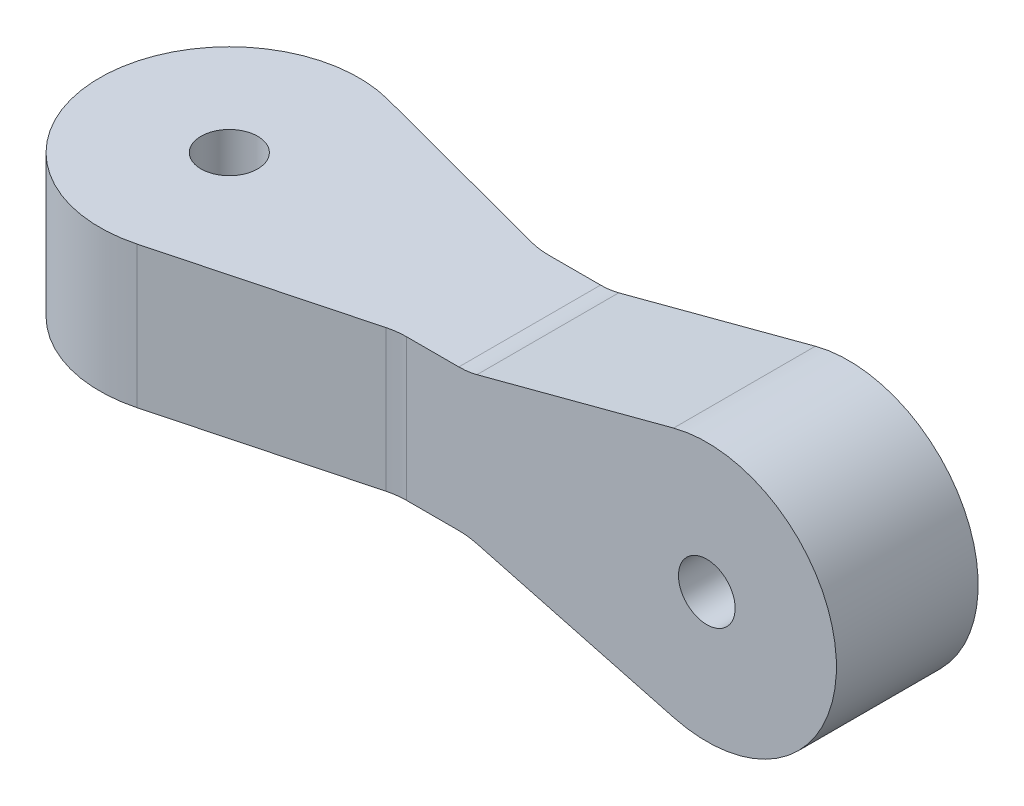
ISO-10303-21;
HEADER;
FILE_DESCRIPTION(('STEP AP214'),'2;1');
FILE_NAME('part.step','',(''),(''),'','','');
FILE_SCHEMA(('AUTOMOTIVE_DESIGN { 1 0 10303 214 1 1 1 1 }'));
ENDSEC;
DATA;
#1=APPLICATION_CONTEXT('core data for automotive mechanical design processes');
#2=APPLICATION_PROTOCOL_DEFINITION('international standard','automotive_design',2000,#1);
#3=PRODUCT_CONTEXT('',#1,'mechanical');
#4=PRODUCT('Part','Part','',(#3));
#5=PRODUCT_RELATED_PRODUCT_CATEGORY('part','',(#4));
#6=PRODUCT_DEFINITION_FORMATION('','',#4);
#7=PRODUCT_DEFINITION_CONTEXT('part definition',#1,'design');
#8=PRODUCT_DEFINITION('design','',#6,#7);
#9=PRODUCT_DEFINITION_SHAPE('','',#8);
#10=(LENGTH_UNIT() NAMED_UNIT(*) SI_UNIT(.MILLI.,.METRE.));
#11=(NAMED_UNIT(*) PLANE_ANGLE_UNIT() SI_UNIT($,.RADIAN.));
#12=(NAMED_UNIT(*) SI_UNIT($,.STERADIAN.) SOLID_ANGLE_UNIT());
#13=UNCERTAINTY_MEASURE_WITH_UNIT(LENGTH_MEASURE(1.E-05),#10,'distance_accuracy_value','');
#14=(GEOMETRIC_REPRESENTATION_CONTEXT(3) GLOBAL_UNCERTAINTY_ASSIGNED_CONTEXT((#13)) GLOBAL_UNIT_ASSIGNED_CONTEXT((#10,
#11,#12)) REPRESENTATION_CONTEXT('',''));
#15=CARTESIAN_POINT('',(0.,0.,0.));
#16=DIRECTION('',(0.,0.,1.));
#17=DIRECTION('',(1.,0.,0.));
#18=AXIS2_PLACEMENT_3D('',#15,#16,#17);
#19=CARTESIAN_POINT('',(0.,0.,-10.));
#20=DIRECTION('',(0.,0.,1.));
#21=DIRECTION('',(1.,0.,0.));
#22=AXIS2_PLACEMENT_3D('',#19,#20,#21);
#23=CYLINDRICAL_SURFACE('',#22,18.2908404288296);
#24=CARTESIAN_POINT('',(0.,0.,10.));
#25=DIRECTION('',(0.,0.,1.));
#26=DIRECTION('',(-1.,0.,0.));
#27=AXIS2_PLACEMENT_3D('',#24,#25,#26);
#28=CIRCLE('',#27,18.2908404288296);
#29=CARTESIAN_POINT('',(-4.6831537061616,-17.6811457478686,10.));
#30=VERTEX_POINT('',#29);
#31=CARTESIAN_POINT('',(-4.6831537061616,17.6811457478686,10.));
#32=VERTEX_POINT('',#31);
#33=EDGE_CURVE('E176',#30,#32,#28,.T.);
#34=ORIENTED_EDGE('',*,*,#33,.F.);
#35=DIRECTION('',(0.,0.,1.));
#36=VECTOR('',#35,1.);
#37=CARTESIAN_POINT('',(-4.6831537061616,-17.6811457478686,-10.));
#38=LINE('',#37,#36);
#39=CARTESIAN_POINT('',(-4.6831537061616,-17.6811457478686,-10.));
#40=VERTEX_POINT('',#39);
#41=EDGE_CURVE('E194',#40,#30,#38,.T.);
#42=ORIENTED_EDGE('',*,*,#41,.F.);
#43=CARTESIAN_POINT('',(0.,0.,-10.));
#44=DIRECTION('',(0.,0.,1.));
#45=DIRECTION('',(-1.,0.,0.));
#46=AXIS2_PLACEMENT_3D('',#43,#44,#45);
#47=CIRCLE('',#46,18.2908404288296);
#48=CARTESIAN_POINT('',(-4.6831537061616,17.6811457478686,-10.));
#49=VERTEX_POINT('',#48);
#50=EDGE_CURVE('E179',#40,#49,#47,.T.);
#51=ORIENTED_EDGE('',*,*,#50,.T.);
#52=DIRECTION('',(0.,0.,1.));
#53=VECTOR('',#52,1.);
#54=CARTESIAN_POINT('',(-4.6831537061616,17.6811457478686,-10.));
#55=LINE('',#54,#53);
#56=EDGE_CURVE('E188',#49,#32,#55,.T.);
#57=ORIENTED_EDGE('',*,*,#56,.T.);
#58=EDGE_LOOP('',(#34,#42,#51,#57));
#59=FACE_BOUND('',#58,.T.);
#60=ADVANCED_FACE('F34',(#59),#23,.T.);
#61=CARTESIAN_POINT('',(-4.6831537061616,-17.6811457478686,-10.));
#62=DIRECTION('',(-0.256038191595621,-0.966666666666667,0.));
#63=DIRECTION('',(0.966666666666667,-0.256038191595621,0.));
#64=AXIS2_PLACEMENT_3D('',#61,#62,#63);
#65=PLANE('',#64);
#66=DIRECTION('',(0.966666666666667,-0.256038191595621,0.));
#67=VECTOR('',#66,1.);
#68=CARTESIAN_POINT('',(-4.6831537061616,-17.6811457478686,10.));
#69=LINE('',#68,#67);
#70=CARTESIAN_POINT('',(-32.4246609000136,-10.3333333333333,10.));
#71=VERTEX_POINT('',#70);
#72=EDGE_CURVE('E183',#71,#30,#69,.T.);
#73=ORIENTED_EDGE('',*,*,#72,.F.);
#74=DIRECTION('',(0.,0.,1.));
#75=VECTOR('',#74,1.);
#76=CARTESIAN_POINT('',(-32.4246609000136,-10.3333333333333,-10.));
#77=LINE('',#76,#75);
#78=CARTESIAN_POINT('',(-32.4246609000136,-10.3333333333333,-10.));
#79=VERTEX_POINT('',#78);
#80=EDGE_CURVE('E201',#71,#79,#77,.F.);
#81=ORIENTED_EDGE('',*,*,#80,.T.);
#82=DIRECTION('',(0.966666666666667,-0.256038191595621,0.));
#83=VECTOR('',#82,1.);
#84=CARTESIAN_POINT('',(-4.6831537061616,-17.6811457478686,-10.));
#85=LINE('',#84,#83);
#86=EDGE_CURVE('E186',#79,#40,#85,.T.);
#87=ORIENTED_EDGE('',*,*,#86,.T.);
#88=ORIENTED_EDGE('',*,*,#41,.T.);
#89=EDGE_LOOP('',(#73,#81,#87,#88));
#90=FACE_BOUND('',#89,.T.);
#91=ADVANCED_FACE('F264',(#90),#65,.T.);
#92=CARTESIAN_POINT('',(-4.6831537061616,17.6811457478686,-10.));
#93=DIRECTION('',(-0.256038191595621,0.966666666666667,0.));
#94=DIRECTION('',(-0.966666666666667,-0.256038191595621,0.));
#95=AXIS2_PLACEMENT_3D('',#92,#93,#94);
#96=PLANE('',#95);
#97=DIRECTION('',(-0.966666666666667,-0.256038191595621,0.));
#98=VECTOR('',#97,1.);
#99=CARTESIAN_POINT('',(-4.6831537061616,17.6811457478686,-10.));
#100=LINE('',#99,#98);
#101=CARTESIAN_POINT('',(-32.4246609000136,10.3333333333333,-10.));
#102=VERTEX_POINT('',#101);
#103=EDGE_CURVE('E182',#49,#102,#100,.T.);
#104=ORIENTED_EDGE('',*,*,#103,.T.);
#105=DIRECTION('',(0.,0.,1.));
#106=VECTOR('',#105,1.);
#107=CARTESIAN_POINT('',(-32.4246609000136,10.3333333333333,-10.));
#108=LINE('',#107,#106);
#109=CARTESIAN_POINT('',(-32.4246609000136,10.3333333333333,10.));
#110=VERTEX_POINT('',#109);
#111=EDGE_CURVE('E203',#102,#110,#108,.T.);
#112=ORIENTED_EDGE('',*,*,#111,.T.);
#113=DIRECTION('',(-0.966666666666667,-0.256038191595621,0.));
#114=VECTOR('',#113,1.);
#115=CARTESIAN_POINT('',(-4.6831537061616,17.6811457478686,10.));
#116=LINE('',#115,#114);
#117=EDGE_CURVE('E191',#32,#110,#116,.T.);
#118=ORIENTED_EDGE('',*,*,#117,.F.);
#119=ORIENTED_EDGE('',*,*,#56,.F.);
#120=EDGE_LOOP('',(#104,#112,#118,#119));
#121=FACE_BOUND('',#120,.T.);
#122=ADVANCED_FACE('F270',(#121),#96,.T.);
#123=CARTESIAN_POINT('',(0.,0.,-10.));
#124=DIRECTION('',(0.,0.,-1.));
#125=DIRECTION('',(-1.,0.,0.));
#126=AXIS2_PLACEMENT_3D('',#123,#124,#125);
#127=PLANE('',#126);
#128=CARTESIAN_POINT('',(0.,0.,-10.));
#129=DIRECTION('',(0.,0.,1.));
#130=DIRECTION('',(1.,0.,0.));
#131=AXIS2_PLACEMENT_3D('',#128,#129,#130);
#132=CIRCLE('',#131,4.);
#133=CARTESIAN_POINT('',(4.,0.,-10.));
#134=VERTEX_POINT('',#133);
#135=EDGE_CURVE('E173',#134,#134,#132,.T.);
#136=ORIENTED_EDGE('',*,*,#135,.T.);
#137=EDGE_LOOP('',(#136));
#138=FACE_BOUND('',#137,.T.);
#139=DIRECTION('',(1.,0.,0.));
#140=VECTOR('',#139,1.);
#141=CARTESIAN_POINT('',(-43.6831537061616,-10.,-10.));
#142=LINE('',#141,#140);
#143=CARTESIAN_POINT('',(-42.3812645963534,-10.,-10.));
#144=VERTEX_POINT('',#143);
#145=CARTESIAN_POINT('',(-34.9850428159698,-10.,-10.));
#146=VERTEX_POINT('',#145);
#147=EDGE_CURVE('E161',#144,#146,#142,.T.);
#148=ORIENTED_EDGE('',*,*,#147,.F.);
#149=DIRECTION('',(0.,-1.,0.));
#150=VECTOR('',#149,1.);
#151=CARTESIAN_POINT('',(-42.3812645963534,10.,-10.));
#152=LINE('',#151,#150);
#153=CARTESIAN_POINT('',(-42.3812645963534,10.,-10.));
#154=VERTEX_POINT('',#153);
#155=EDGE_CURVE('E209',#144,#154,#152,.F.);
#156=ORIENTED_EDGE('',*,*,#155,.T.);
#157=DIRECTION('',(1.,0.,0.));
#158=VECTOR('',#157,1.);
#159=CARTESIAN_POINT('',(-43.6831537061616,10.,-10.));
#160=LINE('',#159,#158);
#161=CARTESIAN_POINT('',(-34.9850428159698,10.,-10.));
#162=VERTEX_POINT('',#161);
#163=EDGE_CURVE('E164',#154,#162,#160,.T.);
#164=ORIENTED_EDGE('',*,*,#163,.T.);
#165=CARTESIAN_POINT('',(-34.9850428159698,20.,-10.));
#166=DIRECTION('',(0.,0.,-1.));
#167=DIRECTION('',(-1.,0.,0.));
#168=AXIS2_PLACEMENT_3D('',#165,#166,#167);
#169=CIRCLE('',#168,10.);
#170=EDGE_CURVE('E221',#162,#102,#169,.F.);
#171=ORIENTED_EDGE('',*,*,#170,.T.);
#172=ORIENTED_EDGE('',*,*,#103,.F.);
#173=ORIENTED_EDGE('',*,*,#50,.F.);
#174=ORIENTED_EDGE('',*,*,#86,.F.);
#175=CARTESIAN_POINT('',(-34.9850428159698,-20.,-10.));
#176=DIRECTION('',(0.,0.,-1.));
#177=DIRECTION('',(-1.,0.,0.));
#178=AXIS2_PLACEMENT_3D('',#175,#176,#177);
#179=CIRCLE('',#178,10.);
#180=EDGE_CURVE('E218',#79,#146,#179,.F.);
#181=ORIENTED_EDGE('',*,*,#180,.T.);
#182=EDGE_LOOP('',(#148,#156,#164,#171,#172,#173,#174,#181));
#183=FACE_BOUND('',#182,.T.);
#184=ADVANCED_FACE('F236',(#138,#183),#127,.T.);
#185=CARTESIAN_POINT('',(0.,0.,10.));
#186=DIRECTION('',(0.,0.,-1.));
#187=DIRECTION('',(-1.,0.,0.));
#188=AXIS2_PLACEMENT_3D('',#185,#186,#187);
#189=PLANE('',#188);
#190=CARTESIAN_POINT('',(0.,0.,10.));
#191=DIRECTION('',(0.,0.,1.));
#192=DIRECTION('',(1.,0.,0.));
#193=AXIS2_PLACEMENT_3D('',#190,#191,#192);
#194=CIRCLE('',#193,4.);
#195=CARTESIAN_POINT('',(4.,0.,10.));
#196=VERTEX_POINT('',#195);
#197=EDGE_CURVE('E172',#196,#196,#194,.T.);
#198=ORIENTED_EDGE('',*,*,#197,.F.);
#199=EDGE_LOOP('',(#198));
#200=FACE_BOUND('',#199,.T.);
#201=DIRECTION('',(1.,0.,0.));
#202=VECTOR('',#201,1.);
#203=CARTESIAN_POINT('',(-43.6831537061616,10.,10.));
#204=LINE('',#203,#202);
#205=CARTESIAN_POINT('',(-42.3812645963534,10.,10.));
#206=VERTEX_POINT('',#205);
#207=CARTESIAN_POINT('',(-34.9850428159698,10.,10.));
#208=VERTEX_POINT('',#207);
#209=EDGE_CURVE('E167',#206,#208,#204,.T.);
#210=ORIENTED_EDGE('',*,*,#209,.F.);
#211=DIRECTION('',(0.,1.,0.));
#212=VECTOR('',#211,1.);
#213=CARTESIAN_POINT('',(-42.3812645963534,-10.,10.));
#214=LINE('',#213,#212);
#215=CARTESIAN_POINT('',(-42.3812645963534,-10.,10.));
#216=VERTEX_POINT('',#215);
#217=EDGE_CURVE('E214',#206,#216,#214,.F.);
#218=ORIENTED_EDGE('',*,*,#217,.T.);
#219=DIRECTION('',(1.,0.,0.));
#220=VECTOR('',#219,1.);
#221=CARTESIAN_POINT('',(-43.6831537061616,-10.,10.));
#222=LINE('',#221,#220);
#223=CARTESIAN_POINT('',(-34.9850428159698,-10.,10.));
#224=VERTEX_POINT('',#223);
#225=EDGE_CURVE('E169',#216,#224,#222,.T.);
#226=ORIENTED_EDGE('',*,*,#225,.T.);
#227=CARTESIAN_POINT('',(-34.9850428159698,-20.,10.));
#228=DIRECTION('',(0.,0.,-1.));
#229=DIRECTION('',(-1.,0.,0.));
#230=AXIS2_PLACEMENT_3D('',#227,#228,#229);
#231=CIRCLE('',#230,10.);
#232=EDGE_CURVE('E216',#224,#71,#231,.T.);
#233=ORIENTED_EDGE('',*,*,#232,.T.);
#234=ORIENTED_EDGE('',*,*,#72,.T.);
#235=ORIENTED_EDGE('',*,*,#33,.T.);
#236=ORIENTED_EDGE('',*,*,#117,.T.);
#237=CARTESIAN_POINT('',(-34.9850428159698,20.,10.));
#238=DIRECTION('',(0.,0.,-1.));
#239=DIRECTION('',(-1.,0.,0.));
#240=AXIS2_PLACEMENT_3D('',#237,#238,#239);
#241=CIRCLE('',#240,10.);
#242=EDGE_CURVE('E49',#110,#208,#241,.T.);
#243=ORIENTED_EDGE('',*,*,#242,.T.);
#244=EDGE_LOOP('',(#210,#218,#226,#233,#234,#235,#236,#243));
#245=FACE_BOUND('',#244,.T.);
#246=ADVANCED_FACE('F245',(#200,#245),#189,.F.);
#247=CARTESIAN_POINT('',(0.,0.,-10.));
#248=DIRECTION('',(0.,0.,1.));
#249=DIRECTION('',(1.,0.,0.));
#250=AXIS2_PLACEMENT_3D('',#247,#248,#249);
#251=CYLINDRICAL_SURFACE('',#250,4.);
#252=ORIENTED_EDGE('',*,*,#135,.F.);
#253=EDGE_LOOP('',(#252));
#254=FACE_BOUND('',#253,.T.);
#255=ORIENTED_EDGE('',*,*,#197,.T.);
#256=EDGE_LOOP('',(#255));
#257=FACE_BOUND('',#256,.T.);
#258=ADVANCED_FACE('F334',(#254,#257),#251,.F.);
#259=CARTESIAN_POINT('',(-43.6831537061616,-10.,-10.));
#260=DIRECTION('',(0.,1.,0.));
#261=DIRECTION('',(0.,0.,1.));
#262=AXIS2_PLACEMENT_3D('',#259,#260,#261);
#263=PLANE('',#262);
#264=ORIENTED_EDGE('',*,*,#147,.T.);
#265=DIRECTION('',(0.,0.,1.));
#266=VECTOR('',#265,1.);
#267=CARTESIAN_POINT('',(-34.9850428159698,-10.,-10.));
#268=LINE('',#267,#266);
#269=EDGE_CURVE('E197',#146,#224,#268,.T.);
#270=ORIENTED_EDGE('',*,*,#269,.T.);
#271=ORIENTED_EDGE('',*,*,#225,.F.);
#272=CARTESIAN_POINT('',(-42.3812645963534,-10.,20.));
#273=DIRECTION('',(0.,1.,0.));
#274=DIRECTION('',(0.,0.,1.));
#275=AXIS2_PLACEMENT_3D('',#272,#273,#274);
#276=CIRCLE('',#275,10.);
#277=CARTESIAN_POINT('',(-44.9416465123096,-10.,10.3333333333333));
#278=VERTEX_POINT('',#277);
#279=EDGE_CURVE('E11',#216,#278,#276,.T.);
#280=ORIENTED_EDGE('',*,*,#279,.T.);
#281=DIRECTION('',(-0.966666666666667,0.,0.25603819159562));
#282=VECTOR('',#281,1.);
#283=CARTESIAN_POINT('',(-0.388637557535156,-10.,-1.46729271107073));
#284=LINE('',#283,#282);
#285=CARTESIAN_POINT('',(-72.6831537061616,-10.,17.6811457478686));
#286=VERTEX_POINT('',#285);
#287=EDGE_CURVE('E142',#278,#286,#284,.T.);
#288=ORIENTED_EDGE('',*,*,#287,.T.);
#289=CARTESIAN_POINT('',(-77.3663074123232,-10.,0.));
#290=DIRECTION('',(0.,1.,0.));
#291=DIRECTION('',(0.,0.,1.));
#292=AXIS2_PLACEMENT_3D('',#289,#290,#291);
#293=CIRCLE('',#292,18.2908404288296);
#294=CARTESIAN_POINT('',(-72.6831537061616,-10.,-17.6811457478686));
#295=VERTEX_POINT('',#294);
#296=EDGE_CURVE('E132',#295,#286,#293,.T.);
#297=ORIENTED_EDGE('',*,*,#296,.F.);
#298=DIRECTION('',(-0.966666666666667,0.,-0.25603819159562));
#299=VECTOR('',#298,1.);
#300=CARTESIAN_POINT('',(-0.388637557535156,-10.,1.46729271107073));
#301=LINE('',#300,#299);
#302=CARTESIAN_POINT('',(-44.9416465123096,-10.,-10.3333333333333));
#303=VERTEX_POINT('',#302);
#304=EDGE_CURVE('E122',#303,#295,#301,.T.);
#305=ORIENTED_EDGE('',*,*,#304,.F.);
#306=CARTESIAN_POINT('',(-42.3812645963534,-10.,-20.));
#307=DIRECTION('',(0.,1.,0.));
#308=DIRECTION('',(0.,0.,1.));
#309=AXIS2_PLACEMENT_3D('',#306,#307,#308);
#310=CIRCLE('',#309,10.);
#311=EDGE_CURVE('E223',#303,#144,#310,.T.);
#312=ORIENTED_EDGE('',*,*,#311,.T.);
#313=EDGE_LOOP('',(#264,#270,#271,#280,#288,#297,#305,#312));
#314=FACE_BOUND('',#313,.T.);
#315=CARTESIAN_POINT('',(-77.3663074123232,-10.,0.));
#316=DIRECTION('',(0.,1.,0.));
#317=DIRECTION('',(0.,0.,1.));
#318=AXIS2_PLACEMENT_3D('',#315,#316,#317);
#319=CIRCLE('',#318,4.00000000000001);
#320=CARTESIAN_POINT('',(-77.3663074123232,-10.,4.00000000000002));
#321=VERTEX_POINT('',#320);
#322=EDGE_CURVE('E133',#321,#321,#319,.T.);
#323=ORIENTED_EDGE('',*,*,#322,.T.);
#324=EDGE_LOOP('',(#323));
#325=FACE_BOUND('',#324,.T.);
#326=ADVANCED_FACE('F145',(#314,#325),#263,.F.);
#327=CARTESIAN_POINT('',(-43.6831537061616,10.,10.));
#328=DIRECTION('',(0.,-1.,0.));
#329=DIRECTION('',(0.,0.,-1.));
#330=AXIS2_PLACEMENT_3D('',#327,#328,#329);
#331=PLANE('',#330);
#332=ORIENTED_EDGE('',*,*,#209,.T.);
#333=DIRECTION('',(0.,0.,1.));
#334=VECTOR('',#333,1.);
#335=CARTESIAN_POINT('',(-34.9850428159698,10.,10.));
#336=LINE('',#335,#334);
#337=EDGE_CURVE('E206',#208,#162,#336,.F.);
#338=ORIENTED_EDGE('',*,*,#337,.T.);
#339=ORIENTED_EDGE('',*,*,#163,.F.);
#340=CARTESIAN_POINT('',(-42.3812645963534,10.,-20.));
#341=DIRECTION('',(0.,-1.,0.));
#342=DIRECTION('',(0.,0.,-1.));
#343=AXIS2_PLACEMENT_3D('',#340,#341,#342);
#344=CIRCLE('',#343,10.);
#345=CARTESIAN_POINT('',(-44.9416465123096,10.,-10.3333333333333));
#346=VERTEX_POINT('',#345);
#347=EDGE_CURVE('E225',#154,#346,#344,.T.);
#348=ORIENTED_EDGE('',*,*,#347,.T.);
#349=DIRECTION('',(-0.966666666666667,0.,-0.25603819159562));
#350=VECTOR('',#349,1.);
#351=CARTESIAN_POINT('',(-0.388637557535156,10.,1.46729271107073));
#352=LINE('',#351,#350);
#353=CARTESIAN_POINT('',(-72.6831537061616,10.,-17.6811457478686));
#354=VERTEX_POINT('',#353);
#355=EDGE_CURVE('E156',#346,#354,#352,.T.);
#356=ORIENTED_EDGE('',*,*,#355,.T.);
#357=CARTESIAN_POINT('',(-77.3663074123232,10.,0.));
#358=DIRECTION('',(0.,1.,0.));
#359=DIRECTION('',(0.,0.,1.));
#360=AXIS2_PLACEMENT_3D('',#357,#358,#359);
#361=CIRCLE('',#360,18.2908404288296);
#362=CARTESIAN_POINT('',(-72.6831537061616,10.,17.6811457478686));
#363=VERTEX_POINT('',#362);
#364=EDGE_CURVE('E140',#354,#363,#361,.T.);
#365=ORIENTED_EDGE('',*,*,#364,.T.);
#366=DIRECTION('',(-0.966666666666667,0.,0.25603819159562));
#367=VECTOR('',#366,1.);
#368=CARTESIAN_POINT('',(-0.388637557535156,10.,-1.46729271107073));
#369=LINE('',#368,#367);
#370=CARTESIAN_POINT('',(-44.9416465123096,10.,10.3333333333333));
#371=VERTEX_POINT('',#370);
#372=EDGE_CURVE('E159',#371,#363,#369,.T.);
#373=ORIENTED_EDGE('',*,*,#372,.F.);
#374=CARTESIAN_POINT('',(-42.3812645963534,10.,20.));
#375=DIRECTION('',(0.,-1.,0.));
#376=DIRECTION('',(0.,0.,-1.));
#377=AXIS2_PLACEMENT_3D('',#374,#375,#376);
#378=CIRCLE('',#377,10.);
#379=EDGE_CURVE('E42',#371,#206,#378,.T.);
#380=ORIENTED_EDGE('',*,*,#379,.T.);
#381=EDGE_LOOP('',(#332,#338,#339,#348,#356,#365,#373,#380));
#382=FACE_BOUND('',#381,.T.);
#383=CARTESIAN_POINT('',(-77.3663074123232,10.,0.));
#384=DIRECTION('',(0.,1.,0.));
#385=DIRECTION('',(0.,0.,1.));
#386=AXIS2_PLACEMENT_3D('',#383,#384,#385);
#387=CIRCLE('',#386,4.00000000000001);
#388=CARTESIAN_POINT('',(-77.3663074123232,10.,4.00000000000002));
#389=VERTEX_POINT('',#388);
#390=EDGE_CURVE('E153',#389,#389,#387,.T.);
#391=ORIENTED_EDGE('',*,*,#390,.F.);
#392=EDGE_LOOP('',(#391));
#393=FACE_BOUND('',#392,.T.);
#394=ADVANCED_FACE('F228',(#382,#393),#331,.F.);
#395=CARTESIAN_POINT('',(-0.388637557535156,-10.,1.46729271107073));
#396=DIRECTION('',(0.25603819159562,0.,-0.966666666666667));
#397=DIRECTION('',(-0.966666666666667,0.,-0.25603819159562));
#398=AXIS2_PLACEMENT_3D('',#395,#396,#397);
#399=PLANE('',#398);
#400=ORIENTED_EDGE('',*,*,#355,.F.);
#401=DIRECTION('',(0.,-1.,0.));
#402=VECTOR('',#401,1.);
#403=CARTESIAN_POINT('',(-44.9416465123096,-10.,-10.3333333333333));
#404=LINE('',#403,#402);
#405=EDGE_CURVE('E129',#346,#303,#404,.T.);
#406=ORIENTED_EDGE('',*,*,#405,.T.);
#407=ORIENTED_EDGE('',*,*,#304,.T.);
#408=DIRECTION('',(0.,1.,0.));
#409=VECTOR('',#408,1.);
#410=CARTESIAN_POINT('',(-72.6831537061616,-10.,-17.6811457478686));
#411=LINE('',#410,#409);
#412=EDGE_CURVE('E126',#295,#354,#411,.T.);
#413=ORIENTED_EDGE('',*,*,#412,.T.);
#414=EDGE_LOOP('',(#400,#406,#407,#413));
#415=FACE_BOUND('',#414,.T.);
#416=ADVANCED_FACE('F125',(#415),#399,.T.);
#417=CARTESIAN_POINT('',(-0.388637557535156,-10.,-1.46729271107073));
#418=DIRECTION('',(-0.25603819159562,0.,-0.966666666666667));
#419=DIRECTION('',(-0.966666666666667,0.,0.25603819159562));
#420=AXIS2_PLACEMENT_3D('',#417,#418,#419);
#421=PLANE('',#420);
#422=ORIENTED_EDGE('',*,*,#287,.F.);
#423=DIRECTION('',(0.,1.,0.));
#424=VECTOR('',#423,1.);
#425=CARTESIAN_POINT('',(-44.9416465123096,10.,10.3333333333333));
#426=LINE('',#425,#424);
#427=EDGE_CURVE('E211',#278,#371,#426,.T.);
#428=ORIENTED_EDGE('',*,*,#427,.T.);
#429=ORIENTED_EDGE('',*,*,#372,.T.);
#430=DIRECTION('',(0.,1.,0.));
#431=VECTOR('',#430,1.);
#432=CARTESIAN_POINT('',(-72.6831537061616,-10.,17.6811457478686));
#433=LINE('',#432,#431);
#434=EDGE_CURVE('E141',#286,#363,#433,.T.);
#435=ORIENTED_EDGE('',*,*,#434,.F.);
#436=EDGE_LOOP('',(#422,#428,#429,#435));
#437=FACE_BOUND('',#436,.T.);
#438=ADVANCED_FACE('F251',(#437),#421,.F.);
#439=CARTESIAN_POINT('',(-77.3663074123232,-10.,0.));
#440=DIRECTION('',(0.,1.,0.));
#441=DIRECTION('',(0.,0.,1.));
#442=AXIS2_PLACEMENT_3D('',#439,#440,#441);
#443=CYLINDRICAL_SURFACE('',#442,4.00000000000001);
#444=ORIENTED_EDGE('',*,*,#322,.F.);
#445=EDGE_LOOP('',(#444));
#446=FACE_BOUND('',#445,.T.);
#447=ORIENTED_EDGE('',*,*,#390,.T.);
#448=EDGE_LOOP('',(#447));
#449=FACE_BOUND('',#448,.T.);
#450=ADVANCED_FACE('F253',(#446,#449),#443,.F.);
#451=CARTESIAN_POINT('',(-77.3663074123232,-10.,0.));
#452=DIRECTION('',(0.,1.,0.));
#453=DIRECTION('',(0.,0.,1.));
#454=AXIS2_PLACEMENT_3D('',#451,#452,#453);
#455=CYLINDRICAL_SURFACE('',#454,18.2908404288296);
#456=ORIENTED_EDGE('',*,*,#364,.F.);
#457=ORIENTED_EDGE('',*,*,#412,.F.);
#458=ORIENTED_EDGE('',*,*,#296,.T.);
#459=ORIENTED_EDGE('',*,*,#434,.T.);
#460=EDGE_LOOP('',(#456,#457,#458,#459));
#461=FACE_BOUND('',#460,.T.);
#462=ADVANCED_FACE('F137',(#461),#455,.T.);
#463=CARTESIAN_POINT('',(-34.9850428159698,-20.,-10.));
#464=DIRECTION('',(0.,0.,1.));
#465=DIRECTION('',(1.,0.,0.));
#466=AXIS2_PLACEMENT_3D('',#463,#464,#465);
#467=CYLINDRICAL_SURFACE('',#466,10.);
#468=ORIENTED_EDGE('',*,*,#180,.F.);
#469=ORIENTED_EDGE('',*,*,#80,.F.);
#470=ORIENTED_EDGE('',*,*,#232,.F.);
#471=ORIENTED_EDGE('',*,*,#269,.F.);
#472=EDGE_LOOP('',(#468,#469,#470,#471));
#473=FACE_BOUND('',#472,.T.);
#474=ADVANCED_FACE('F242',(#473),#467,.F.);
#475=CARTESIAN_POINT('',(-34.9850428159698,20.,-10.));
#476=DIRECTION('',(0.,0.,1.));
#477=DIRECTION('',(1.,0.,0.));
#478=AXIS2_PLACEMENT_3D('',#475,#476,#477);
#479=CYLINDRICAL_SURFACE('',#478,10.);
#480=ORIENTED_EDGE('',*,*,#170,.F.);
#481=ORIENTED_EDGE('',*,*,#337,.F.);
#482=ORIENTED_EDGE('',*,*,#242,.F.);
#483=ORIENTED_EDGE('',*,*,#111,.F.);
#484=EDGE_LOOP('',(#480,#481,#482,#483));
#485=FACE_BOUND('',#484,.T.);
#486=ADVANCED_FACE('F278',(#485),#479,.F.);
#487=CARTESIAN_POINT('',(-42.3812645963534,-10.,-20.));
#488=DIRECTION('',(0.,1.,0.));
#489=DIRECTION('',(0.,0.,1.));
#490=AXIS2_PLACEMENT_3D('',#487,#488,#489);
#491=CYLINDRICAL_SURFACE('',#490,10.);
#492=ORIENTED_EDGE('',*,*,#347,.F.);
#493=ORIENTED_EDGE('',*,*,#155,.F.);
#494=ORIENTED_EDGE('',*,*,#311,.F.);
#495=ORIENTED_EDGE('',*,*,#405,.F.);
#496=EDGE_LOOP('',(#492,#493,#494,#495));
#497=FACE_BOUND('',#496,.T.);
#498=ADVANCED_FACE('F232',(#497),#491,.F.);
#499=CARTESIAN_POINT('',(-42.3812645963534,-10.,20.));
#500=DIRECTION('',(0.,-1.,0.));
#501=DIRECTION('',(0.,0.,-1.));
#502=AXIS2_PLACEMENT_3D('',#499,#500,#501);
#503=CYLINDRICAL_SURFACE('',#502,10.);
#504=ORIENTED_EDGE('',*,*,#279,.F.);
#505=ORIENTED_EDGE('',*,*,#217,.F.);
#506=ORIENTED_EDGE('',*,*,#379,.F.);
#507=ORIENTED_EDGE('',*,*,#427,.F.);
#508=EDGE_LOOP('',(#504,#505,#506,#507));
#509=FACE_BOUND('',#508,.T.);
#510=ADVANCED_FACE('F36',(#509),#503,.F.);
#511=CLOSED_SHELL('',(#60,#91,#122,#184,#246,#258,#326,#394,#416,#438,#450,#462,#474,#486,#498,#510));
#512=MANIFOLD_SOLID_BREP('B2',#511);
#513=ADVANCED_BREP_SHAPE_REPRESENTATION('',(#18,#512),#14);
#514=SHAPE_DEFINITION_REPRESENTATION(#9,#513);
ENDSEC;
END-ISO-10303-21;
